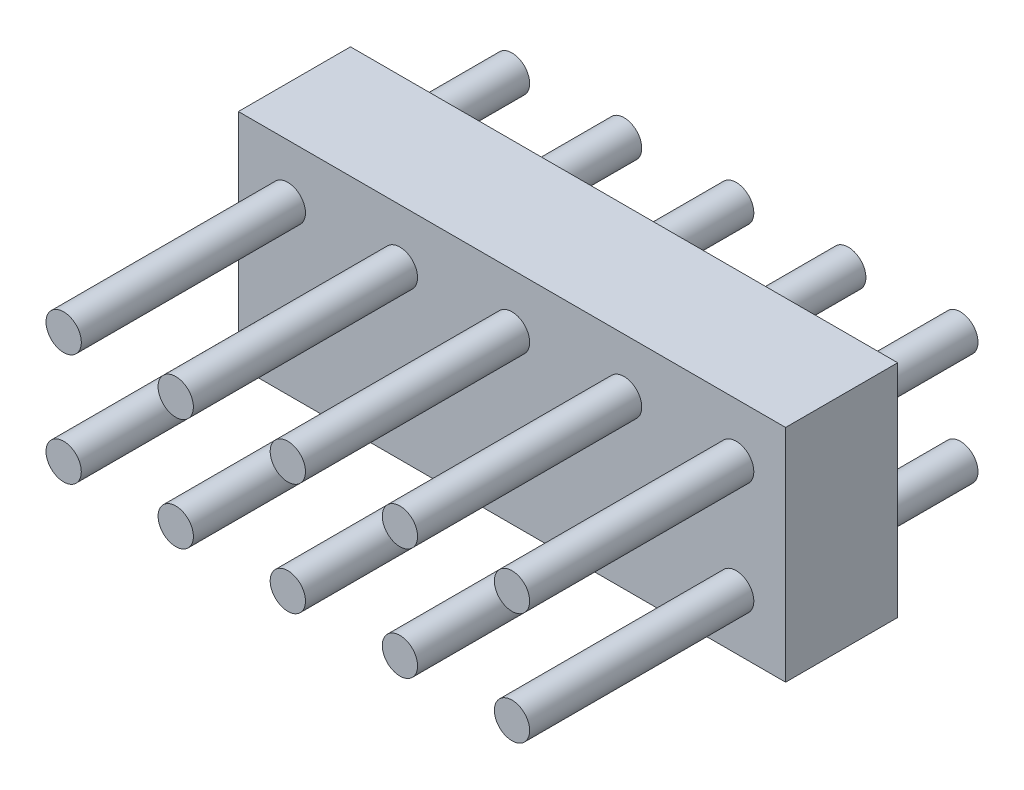
ISO-10303-21;
HEADER;
FILE_DESCRIPTION(('STEP AP214'),'2;1');
FILE_NAME('part.step','',(''),(''),'','','');
FILE_SCHEMA(('AUTOMOTIVE_DESIGN { 1 0 10303 214 1 1 1 1 }'));
ENDSEC;
DATA;
#1=APPLICATION_CONTEXT('core data for automotive mechanical design processes');
#2=APPLICATION_PROTOCOL_DEFINITION('international standard','automotive_design',2000,#1);
#3=PRODUCT_CONTEXT('',#1,'mechanical');
#4=PRODUCT('Part','Part','',(#3));
#5=PRODUCT_RELATED_PRODUCT_CATEGORY('part','',(#4));
#6=PRODUCT_DEFINITION_FORMATION('','',#4);
#7=PRODUCT_DEFINITION_CONTEXT('part definition',#1,'design');
#8=PRODUCT_DEFINITION('design','',#6,#7);
#9=PRODUCT_DEFINITION_SHAPE('','',#8);
#10=(LENGTH_UNIT() NAMED_UNIT(*) SI_UNIT(.MILLI.,.METRE.));
#11=(NAMED_UNIT(*) PLANE_ANGLE_UNIT() SI_UNIT($,.RADIAN.));
#12=(NAMED_UNIT(*) SI_UNIT($,.STERADIAN.) SOLID_ANGLE_UNIT());
#13=UNCERTAINTY_MEASURE_WITH_UNIT(LENGTH_MEASURE(1.E-05),#10,'distance_accuracy_value','');
#14=(GEOMETRIC_REPRESENTATION_CONTEXT(3) GLOBAL_UNCERTAINTY_ASSIGNED_CONTEXT((#13)) GLOBAL_UNIT_ASSIGNED_CONTEXT((#10,
#11,#12)) REPRESENTATION_CONTEXT('',''));
#15=CARTESIAN_POINT('',(0.,0.,0.));
#16=DIRECTION('',(0.,0.,1.));
#17=DIRECTION('',(1.,0.,0.));
#18=AXIS2_PLACEMENT_3D('',#15,#16,#17);
#19=CARTESIAN_POINT('',(0.,-5.,2.54));
#20=DIRECTION('',(0.,0.,1.));
#21=DIRECTION('',(1.,0.,0.));
#22=AXIS2_PLACEMENT_3D('',#19,#20,#21);
#23=PLANE('',#22);
#24=CARTESIAN_POINT('',(3.66,-3.77,2.54));
#25=DIRECTION('',(0.,0.,1.));
#26=DIRECTION('',(1.,0.,0.));
#27=AXIS2_PLACEMENT_3D('',#24,#25,#26);
#28=CIRCLE('',#27,0.4);
#29=CARTESIAN_POINT('',(4.06,-3.77,2.54));
#30=VERTEX_POINT('',#29);
#31=EDGE_CURVE('E277',#30,#30,#28,.F.);
#32=ORIENTED_EDGE('',*,*,#31,.T.);
#33=EDGE_LOOP('',(#32));
#34=FACE_BOUND('',#33,.T.);
#35=CARTESIAN_POINT('',(8.74,-3.77,2.54));
#36=DIRECTION('',(0.,0.,1.));
#37=DIRECTION('',(1.,0.,0.));
#38=AXIS2_PLACEMENT_3D('',#35,#36,#37);
#39=CIRCLE('',#38,0.4);
#40=CARTESIAN_POINT('',(9.14,-3.77,2.54));
#41=VERTEX_POINT('',#40);
#42=EDGE_CURVE('E259',#41,#41,#39,.F.);
#43=ORIENTED_EDGE('',*,*,#42,.T.);
#44=EDGE_LOOP('',(#43));
#45=FACE_BOUND('',#44,.T.);
#46=CARTESIAN_POINT('',(3.66,-1.23,2.54));
#47=DIRECTION('',(0.,0.,1.));
#48=DIRECTION('',(1.,0.,0.));
#49=AXIS2_PLACEMENT_3D('',#46,#47,#48);
#50=CIRCLE('',#49,0.4);
#51=CARTESIAN_POINT('',(4.06,-1.23,2.54));
#52=VERTEX_POINT('',#51);
#53=EDGE_CURVE('E241',#52,#52,#50,.F.);
#54=ORIENTED_EDGE('',*,*,#53,.T.);
#55=EDGE_LOOP('',(#54));
#56=FACE_BOUND('',#55,.T.);
#57=CARTESIAN_POINT('',(8.74,-1.23,2.54));
#58=DIRECTION('',(0.,0.,1.));
#59=DIRECTION('',(1.,0.,0.));
#60=AXIS2_PLACEMENT_3D('',#57,#58,#59);
#61=CIRCLE('',#60,0.4);
#62=CARTESIAN_POINT('',(9.14,-1.23,2.54));
#63=VERTEX_POINT('',#62);
#64=EDGE_CURVE('E223',#63,#63,#61,.F.);
#65=ORIENTED_EDGE('',*,*,#64,.T.);
#66=EDGE_LOOP('',(#65));
#67=FACE_BOUND('',#66,.T.);
#68=CARTESIAN_POINT('',(6.2,-1.23,2.54));
#69=DIRECTION('',(0.,0.,1.));
#70=DIRECTION('',(1.,0.,0.));
#71=AXIS2_PLACEMENT_3D('',#68,#69,#70);
#72=CIRCLE('',#71,0.4);
#73=CARTESIAN_POINT('',(6.6,-1.23,2.54));
#74=VERTEX_POINT('',#73);
#75=EDGE_CURVE('E108',#74,#74,#72,.F.);
#76=ORIENTED_EDGE('',*,*,#75,.T.);
#77=EDGE_LOOP('',(#76));
#78=FACE_BOUND('',#77,.T.);
#79=DIRECTION('',(0.,-1.,0.));
#80=VECTOR('',#79,1.);
#81=CARTESIAN_POINT('',(0.,0.,2.54));
#82=LINE('',#81,#80);
#83=CARTESIAN_POINT('',(0.,0.,2.54));
#84=VERTEX_POINT('',#83);
#85=CARTESIAN_POINT('',(0.,-5.,2.54));
#86=VERTEX_POINT('',#85);
#87=EDGE_CURVE('E90',#84,#86,#82,.T.);
#88=ORIENTED_EDGE('',*,*,#87,.T.);
#89=DIRECTION('',(1.,0.,0.));
#90=VECTOR('',#89,1.);
#91=CARTESIAN_POINT('',(0.,-5.,2.54));
#92=LINE('',#91,#90);
#93=CARTESIAN_POINT('',(12.4,-5.,2.54));
#94=VERTEX_POINT('',#93);
#95=EDGE_CURVE('E85',#86,#94,#92,.T.);
#96=ORIENTED_EDGE('',*,*,#95,.T.);
#97=DIRECTION('',(0.,1.,0.));
#98=VECTOR('',#97,1.);
#99=CARTESIAN_POINT('',(12.4,0.,2.54));
#100=LINE('',#99,#98);
#101=CARTESIAN_POINT('',(12.4,0.,2.54));
#102=VERTEX_POINT('',#101);
#103=EDGE_CURVE('E88',#94,#102,#100,.T.);
#104=ORIENTED_EDGE('',*,*,#103,.T.);
#105=DIRECTION('',(-1.,0.,0.));
#106=VECTOR('',#105,1.);
#107=CARTESIAN_POINT('',(0.,0.,2.54));
#108=LINE('',#107,#106);
#109=EDGE_CURVE('E54',#102,#84,#108,.T.);
#110=ORIENTED_EDGE('',*,*,#109,.T.);
#111=EDGE_LOOP('',(#88,#96,#104,#110));
#112=FACE_BOUND('',#111,.T.);
#113=CARTESIAN_POINT('',(1.12,-1.23,2.54));
#114=DIRECTION('',(0.,0.,1.));
#115=DIRECTION('',(1.,0.,0.));
#116=AXIS2_PLACEMENT_3D('',#113,#114,#115);
#117=CIRCLE('',#116,0.400000000000001);
#118=CARTESIAN_POINT('',(1.52000000000001,-1.23,2.54));
#119=VERTEX_POINT('',#118);
#120=EDGE_CURVE('E214',#119,#119,#117,.F.);
#121=ORIENTED_EDGE('',*,*,#120,.T.);
#122=EDGE_LOOP('',(#121));
#123=FACE_BOUND('',#122,.T.);
#124=CARTESIAN_POINT('',(11.28,-1.23,2.54));
#125=DIRECTION('',(0.,0.,1.));
#126=DIRECTION('',(1.,0.,0.));
#127=AXIS2_PLACEMENT_3D('',#124,#125,#126);
#128=CIRCLE('',#127,0.400000000000001);
#129=CARTESIAN_POINT('',(11.68,-1.23,2.54));
#130=VERTEX_POINT('',#129);
#131=EDGE_CURVE('E232',#130,#130,#128,.F.);
#132=ORIENTED_EDGE('',*,*,#131,.T.);
#133=EDGE_LOOP('',(#132));
#134=FACE_BOUND('',#133,.T.);
#135=CARTESIAN_POINT('',(11.28,-3.77,2.54));
#136=DIRECTION('',(0.,0.,1.));
#137=DIRECTION('',(1.,0.,0.));
#138=AXIS2_PLACEMENT_3D('',#135,#136,#137);
#139=CIRCLE('',#138,0.400000000000001);
#140=CARTESIAN_POINT('',(11.68,-3.77,2.54));
#141=VERTEX_POINT('',#140);
#142=EDGE_CURVE('E250',#141,#141,#139,.F.);
#143=ORIENTED_EDGE('',*,*,#142,.T.);
#144=EDGE_LOOP('',(#143));
#145=FACE_BOUND('',#144,.T.);
#146=CARTESIAN_POINT('',(6.2,-3.77,2.54));
#147=DIRECTION('',(0.,0.,1.));
#148=DIRECTION('',(1.,0.,0.));
#149=AXIS2_PLACEMENT_3D('',#146,#147,#148);
#150=CIRCLE('',#149,0.4);
#151=CARTESIAN_POINT('',(6.6,-3.77,2.54));
#152=VERTEX_POINT('',#151);
#153=EDGE_CURVE('E268',#152,#152,#150,.F.);
#154=ORIENTED_EDGE('',*,*,#153,.T.);
#155=EDGE_LOOP('',(#154));
#156=FACE_BOUND('',#155,.T.);
#157=CARTESIAN_POINT('',(1.12,-3.77,2.54));
#158=DIRECTION('',(0.,0.,1.));
#159=DIRECTION('',(1.,0.,0.));
#160=AXIS2_PLACEMENT_3D('',#157,#158,#159);
#161=CIRCLE('',#160,0.400000000000002);
#162=CARTESIAN_POINT('',(1.52000000000001,-3.77,2.54));
#163=VERTEX_POINT('',#162);
#164=EDGE_CURVE('E285',#163,#163,#161,.F.);
#165=ORIENTED_EDGE('',*,*,#164,.T.);
#166=EDGE_LOOP('',(#165));
#167=FACE_BOUND('',#166,.T.);
#168=ADVANCED_FACE('F37',(#34,#45,#56,#67,#78,#112,#123,#134,#145,#156,#167),#23,.T.);
#169=CARTESIAN_POINT('',(0.,-5.,0.));
#170=DIRECTION('',(0.,0.,1.));
#171=DIRECTION('',(1.,0.,0.));
#172=AXIS2_PLACEMENT_3D('',#169,#170,#171);
#173=PLANE('',#172);
#174=CARTESIAN_POINT('',(3.66,-3.77,0.));
#175=DIRECTION('',(0.,0.,1.));
#176=DIRECTION('',(1.,0.,0.));
#177=AXIS2_PLACEMENT_3D('',#174,#175,#176);
#178=CIRCLE('',#177,0.4);
#179=CARTESIAN_POINT('',(4.06,-3.77,0.));
#180=VERTEX_POINT('',#179);
#181=EDGE_CURVE('E46',#180,#180,#178,.F.);
#182=ORIENTED_EDGE('',*,*,#181,.F.);
#183=EDGE_LOOP('',(#182));
#184=FACE_BOUND('',#183,.T.);
#185=CARTESIAN_POINT('',(8.74,-3.77,0.));
#186=DIRECTION('',(0.,0.,1.));
#187=DIRECTION('',(1.,0.,0.));
#188=AXIS2_PLACEMENT_3D('',#185,#186,#187);
#189=CIRCLE('',#188,0.4);
#190=CARTESIAN_POINT('',(9.14,-3.77,0.));
#191=VERTEX_POINT('',#190);
#192=EDGE_CURVE('E133',#191,#191,#189,.F.);
#193=ORIENTED_EDGE('',*,*,#192,.F.);
#194=EDGE_LOOP('',(#193));
#195=FACE_BOUND('',#194,.T.);
#196=CARTESIAN_POINT('',(3.66,-1.23,0.));
#197=DIRECTION('',(0.,0.,1.));
#198=DIRECTION('',(1.,0.,0.));
#199=AXIS2_PLACEMENT_3D('',#196,#197,#198);
#200=CIRCLE('',#199,0.4);
#201=CARTESIAN_POINT('',(4.06,-1.23,0.));
#202=VERTEX_POINT('',#201);
#203=EDGE_CURVE('E127',#202,#202,#200,.F.);
#204=ORIENTED_EDGE('',*,*,#203,.F.);
#205=EDGE_LOOP('',(#204));
#206=FACE_BOUND('',#205,.T.);
#207=CARTESIAN_POINT('',(8.74,-1.23,0.));
#208=DIRECTION('',(0.,0.,1.));
#209=DIRECTION('',(1.,0.,0.));
#210=AXIS2_PLACEMENT_3D('',#207,#208,#209);
#211=CIRCLE('',#210,0.4);
#212=CARTESIAN_POINT('',(9.14,-1.23,0.));
#213=VERTEX_POINT('',#212);
#214=EDGE_CURVE('E121',#213,#213,#211,.F.);
#215=ORIENTED_EDGE('',*,*,#214,.F.);
#216=EDGE_LOOP('',(#215));
#217=FACE_BOUND('',#216,.T.);
#218=CARTESIAN_POINT('',(6.2,-1.23,0.));
#219=DIRECTION('',(0.,0.,1.));
#220=DIRECTION('',(1.,0.,0.));
#221=AXIS2_PLACEMENT_3D('',#218,#219,#220);
#222=CIRCLE('',#221,0.4);
#223=CARTESIAN_POINT('',(6.6,-1.23,0.));
#224=VERTEX_POINT('',#223);
#225=EDGE_CURVE('E115',#224,#224,#222,.F.);
#226=ORIENTED_EDGE('',*,*,#225,.F.);
#227=EDGE_LOOP('',(#226));
#228=FACE_BOUND('',#227,.T.);
#229=DIRECTION('',(0.,-1.,0.));
#230=VECTOR('',#229,1.);
#231=CARTESIAN_POINT('',(0.,0.,0.));
#232=LINE('',#231,#230);
#233=CARTESIAN_POINT('',(0.,0.,0.));
#234=VERTEX_POINT('',#233);
#235=CARTESIAN_POINT('',(0.,-5.,0.));
#236=VERTEX_POINT('',#235);
#237=EDGE_CURVE('E105',#234,#236,#232,.T.);
#238=ORIENTED_EDGE('',*,*,#237,.F.);
#239=DIRECTION('',(-1.,0.,0.));
#240=VECTOR('',#239,1.);
#241=CARTESIAN_POINT('',(0.,0.,0.));
#242=LINE('',#241,#240);
#243=CARTESIAN_POINT('',(12.4,0.,0.));
#244=VERTEX_POINT('',#243);
#245=EDGE_CURVE('E77',#244,#234,#242,.T.);
#246=ORIENTED_EDGE('',*,*,#245,.F.);
#247=DIRECTION('',(0.,1.,0.));
#248=VECTOR('',#247,1.);
#249=CARTESIAN_POINT('',(12.4,0.,0.));
#250=LINE('',#249,#248);
#251=CARTESIAN_POINT('',(12.4,-5.,0.));
#252=VERTEX_POINT('',#251);
#253=EDGE_CURVE('E71',#252,#244,#250,.T.);
#254=ORIENTED_EDGE('',*,*,#253,.F.);
#255=DIRECTION('',(1.,0.,0.));
#256=VECTOR('',#255,1.);
#257=CARTESIAN_POINT('',(0.,-5.,0.));
#258=LINE('',#257,#256);
#259=EDGE_CURVE('E95',#236,#252,#258,.T.);
#260=ORIENTED_EDGE('',*,*,#259,.F.);
#261=EDGE_LOOP('',(#238,#246,#254,#260));
#262=FACE_BOUND('',#261,.T.);
#263=CARTESIAN_POINT('',(1.12,-1.23,0.));
#264=DIRECTION('',(0.,0.,1.));
#265=DIRECTION('',(1.,0.,0.));
#266=AXIS2_PLACEMENT_3D('',#263,#264,#265);
#267=CIRCLE('',#266,0.400000000000001);
#268=CARTESIAN_POINT('',(1.52000000000001,-1.23,0.));
#269=VERTEX_POINT('',#268);
#270=EDGE_CURVE('E118',#269,#269,#267,.F.);
#271=ORIENTED_EDGE('',*,*,#270,.F.);
#272=EDGE_LOOP('',(#271));
#273=FACE_BOUND('',#272,.T.);
#274=CARTESIAN_POINT('',(11.28,-1.23,0.));
#275=DIRECTION('',(0.,0.,1.));
#276=DIRECTION('',(1.,0.,0.));
#277=AXIS2_PLACEMENT_3D('',#274,#275,#276);
#278=CIRCLE('',#277,0.400000000000001);
#279=CARTESIAN_POINT('',(11.68,-1.23,0.));
#280=VERTEX_POINT('',#279);
#281=EDGE_CURVE('E124',#280,#280,#278,.F.);
#282=ORIENTED_EDGE('',*,*,#281,.F.);
#283=EDGE_LOOP('',(#282));
#284=FACE_BOUND('',#283,.T.);
#285=CARTESIAN_POINT('',(11.28,-3.77,0.));
#286=DIRECTION('',(0.,0.,1.));
#287=DIRECTION('',(1.,0.,0.));
#288=AXIS2_PLACEMENT_3D('',#285,#286,#287);
#289=CIRCLE('',#288,0.400000000000001);
#290=CARTESIAN_POINT('',(11.68,-3.77,0.));
#291=VERTEX_POINT('',#290);
#292=EDGE_CURVE('E130',#291,#291,#289,.F.);
#293=ORIENTED_EDGE('',*,*,#292,.F.);
#294=EDGE_LOOP('',(#293));
#295=FACE_BOUND('',#294,.T.);
#296=CARTESIAN_POINT('',(6.2,-3.77,0.));
#297=DIRECTION('',(0.,0.,1.));
#298=DIRECTION('',(1.,0.,0.));
#299=AXIS2_PLACEMENT_3D('',#296,#297,#298);
#300=CIRCLE('',#299,0.4);
#301=CARTESIAN_POINT('',(6.6,-3.77,0.));
#302=VERTEX_POINT('',#301);
#303=EDGE_CURVE('E136',#302,#302,#300,.F.);
#304=ORIENTED_EDGE('',*,*,#303,.F.);
#305=EDGE_LOOP('',(#304));
#306=FACE_BOUND('',#305,.T.);
#307=CARTESIAN_POINT('',(1.12,-3.77,0.));
#308=DIRECTION('',(0.,0.,1.));
#309=DIRECTION('',(1.,0.,0.));
#310=AXIS2_PLACEMENT_3D('',#307,#308,#309);
#311=CIRCLE('',#310,0.400000000000002);
#312=CARTESIAN_POINT('',(1.52000000000001,-3.77,0.));
#313=VERTEX_POINT('',#312);
#314=EDGE_CURVE('E11',#313,#313,#311,.F.);
#315=ORIENTED_EDGE('',*,*,#314,.F.);
#316=EDGE_LOOP('',(#315));
#317=FACE_BOUND('',#316,.T.);
#318=ADVANCED_FACE('F143',(#184,#195,#206,#217,#228,#262,#273,#284,#295,#306,#317),#173,.F.);
#319=CARTESIAN_POINT('',(0.,0.,2.54));
#320=DIRECTION('',(1.,0.,0.));
#321=DIRECTION('',(0.,1.,0.));
#322=AXIS2_PLACEMENT_3D('',#319,#320,#321);
#323=PLANE('',#322);
#324=ORIENTED_EDGE('',*,*,#237,.T.);
#325=DIRECTION('',(0.,0.,-1.));
#326=VECTOR('',#325,1.);
#327=CARTESIAN_POINT('',(0.,-5.,2.54));
#328=LINE('',#327,#326);
#329=EDGE_CURVE('E96',#86,#236,#328,.T.);
#330=ORIENTED_EDGE('',*,*,#329,.F.);
#331=ORIENTED_EDGE('',*,*,#87,.F.);
#332=DIRECTION('',(0.,0.,-1.));
#333=VECTOR('',#332,1.);
#334=CARTESIAN_POINT('',(0.,0.,2.54));
#335=LINE('',#334,#333);
#336=EDGE_CURVE('E101',#84,#234,#335,.T.);
#337=ORIENTED_EDGE('',*,*,#336,.T.);
#338=EDGE_LOOP('',(#324,#330,#331,#337));
#339=FACE_BOUND('',#338,.T.);
#340=ADVANCED_FACE('F39',(#339),#323,.F.);
#341=CARTESIAN_POINT('',(0.,-5.,2.54));
#342=DIRECTION('',(0.,1.,0.));
#343=DIRECTION('',(0.,0.,1.));
#344=AXIS2_PLACEMENT_3D('',#341,#342,#343);
#345=PLANE('',#344);
#346=ORIENTED_EDGE('',*,*,#259,.T.);
#347=DIRECTION('',(0.,0.,-1.));
#348=VECTOR('',#347,1.);
#349=CARTESIAN_POINT('',(12.4,-5.,2.54));
#350=LINE('',#349,#348);
#351=EDGE_CURVE('E93',#94,#252,#350,.T.);
#352=ORIENTED_EDGE('',*,*,#351,.F.);
#353=ORIENTED_EDGE('',*,*,#95,.F.);
#354=ORIENTED_EDGE('',*,*,#329,.T.);
#355=EDGE_LOOP('',(#346,#352,#353,#354));
#356=FACE_BOUND('',#355,.T.);
#357=ADVANCED_FACE('F94',(#356),#345,.F.);
#358=CARTESIAN_POINT('',(12.4,0.,2.54));
#359=DIRECTION('',(-1.,0.,0.));
#360=DIRECTION('',(0.,-1.,0.));
#361=AXIS2_PLACEMENT_3D('',#358,#359,#360);
#362=PLANE('',#361);
#363=ORIENTED_EDGE('',*,*,#253,.T.);
#364=DIRECTION('',(0.,0.,-1.));
#365=VECTOR('',#364,1.);
#366=CARTESIAN_POINT('',(12.4,0.,2.54));
#367=LINE('',#366,#365);
#368=EDGE_CURVE('E97',#102,#244,#367,.T.);
#369=ORIENTED_EDGE('',*,*,#368,.F.);
#370=ORIENTED_EDGE('',*,*,#103,.F.);
#371=ORIENTED_EDGE('',*,*,#351,.T.);
#372=EDGE_LOOP('',(#363,#369,#370,#371));
#373=FACE_BOUND('',#372,.T.);
#374=ADVANCED_FACE('F99',(#373),#362,.F.);
#375=CARTESIAN_POINT('',(0.,0.,2.54));
#376=DIRECTION('',(0.,-1.,0.));
#377=DIRECTION('',(0.,0.,-1.));
#378=AXIS2_PLACEMENT_3D('',#375,#376,#377);
#379=PLANE('',#378);
#380=ORIENTED_EDGE('',*,*,#245,.T.);
#381=ORIENTED_EDGE('',*,*,#336,.F.);
#382=ORIENTED_EDGE('',*,*,#109,.F.);
#383=ORIENTED_EDGE('',*,*,#368,.T.);
#384=EDGE_LOOP('',(#380,#381,#382,#383));
#385=FACE_BOUND('',#384,.T.);
#386=ADVANCED_FACE('F195',(#385),#379,.F.);
#387=CARTESIAN_POINT('',(6.2,-1.23,-2.54));
#388=DIRECTION('',(0.,0.,1.));
#389=DIRECTION('',(1.,0.,0.));
#390=AXIS2_PLACEMENT_3D('',#387,#388,#389);
#391=PLANE('',#390);
#392=CARTESIAN_POINT('',(6.2,-1.23,-2.54));
#393=DIRECTION('',(0.,0.,1.));
#394=DIRECTION('',(1.,0.,0.));
#395=AXIS2_PLACEMENT_3D('',#392,#393,#394);
#396=CIRCLE('',#395,0.4);
#397=CARTESIAN_POINT('',(6.6,-1.23,-2.54));
#398=VERTEX_POINT('',#397);
#399=EDGE_CURVE('E211',#398,#398,#396,.T.);
#400=ORIENTED_EDGE('',*,*,#399,.F.);
#401=EDGE_LOOP('',(#400));
#402=FACE_BOUND('',#401,.T.);
#403=ADVANCED_FACE('F198',(#402),#391,.F.);
#404=CARTESIAN_POINT('',(6.2,-1.23,7.62));
#405=DIRECTION('',(0.,0.,-1.));
#406=DIRECTION('',(-1.,0.,0.));
#407=AXIS2_PLACEMENT_3D('',#404,#405,#406);
#408=CYLINDRICAL_SURFACE('',#407,0.4);
#409=ORIENTED_EDGE('',*,*,#399,.T.);
#410=EDGE_LOOP('',(#409));
#411=FACE_BOUND('',#410,.T.);
#412=ORIENTED_EDGE('',*,*,#225,.T.);
#413=EDGE_LOOP('',(#412));
#414=FACE_BOUND('',#413,.T.);
#415=ADVANCED_FACE('F643',(#411,#414),#408,.T.);
#416=ORIENTED_EDGE('',*,*,#75,.F.);
#417=EDGE_LOOP('',(#416));
#418=FACE_BOUND('',#417,.T.);
#419=CARTESIAN_POINT('',(6.2,-1.23,7.62));
#420=DIRECTION('',(0.,0.,1.));
#421=DIRECTION('',(1.,0.,0.));
#422=AXIS2_PLACEMENT_3D('',#419,#420,#421);
#423=CIRCLE('',#422,0.4);
#424=CARTESIAN_POINT('',(6.6,-1.23,7.62));
#425=VERTEX_POINT('',#424);
#426=EDGE_CURVE('E210',#425,#425,#423,.T.);
#427=ORIENTED_EDGE('',*,*,#426,.F.);
#428=EDGE_LOOP('',(#427));
#429=FACE_BOUND('',#428,.T.);
#430=ADVANCED_FACE('F192',(#418,#429),#408,.T.);
#431=CARTESIAN_POINT('',(6.2,-1.23,7.62));
#432=DIRECTION('',(0.,0.,1.));
#433=DIRECTION('',(1.,0.,0.));
#434=AXIS2_PLACEMENT_3D('',#431,#432,#433);
#435=PLANE('',#434);
#436=ORIENTED_EDGE('',*,*,#426,.T.);
#437=EDGE_LOOP('',(#436));
#438=FACE_BOUND('',#437,.T.);
#439=ADVANCED_FACE('F624',(#438),#435,.T.);
#440=CARTESIAN_POINT('',(1.12,-1.23,-2.54));
#441=DIRECTION('',(0.,0.,-1.));
#442=DIRECTION('',(-1.,0.,0.));
#443=AXIS2_PLACEMENT_3D('',#440,#441,#442);
#444=PLANE('',#443);
#445=CARTESIAN_POINT('',(1.12,-1.23,-2.54));
#446=DIRECTION('',(0.,0.,1.));
#447=DIRECTION('',(-1.,0.,0.));
#448=AXIS2_PLACEMENT_3D('',#445,#446,#447);
#449=CIRCLE('',#448,0.400000000000001);
#450=CARTESIAN_POINT('',(0.720000000000003,-1.23,-2.54));
#451=VERTEX_POINT('',#450);
#452=EDGE_CURVE('E220',#451,#451,#449,.T.);
#453=ORIENTED_EDGE('',*,*,#452,.F.);
#454=EDGE_LOOP('',(#453));
#455=FACE_BOUND('',#454,.T.);
#456=ADVANCED_FACE('F615',(#455),#444,.T.);
#457=CARTESIAN_POINT('',(1.12,-1.23,7.62));
#458=DIRECTION('',(0.,0.,-1.));
#459=DIRECTION('',(-1.,0.,0.));
#460=AXIS2_PLACEMENT_3D('',#457,#458,#459);
#461=CYLINDRICAL_SURFACE('',#460,0.400000000000001);
#462=ORIENTED_EDGE('',*,*,#452,.T.);
#463=EDGE_LOOP('',(#462));
#464=FACE_BOUND('',#463,.T.);
#465=ORIENTED_EDGE('',*,*,#270,.T.);
#466=EDGE_LOOP('',(#465));
#467=FACE_BOUND('',#466,.T.);
#468=ADVANCED_FACE('F605',(#464,#467),#461,.T.);
#469=ORIENTED_EDGE('',*,*,#120,.F.);
#470=EDGE_LOOP('',(#469));
#471=FACE_BOUND('',#470,.T.);
#472=CARTESIAN_POINT('',(1.12,-1.23,7.62));
#473=DIRECTION('',(0.,0.,1.));
#474=DIRECTION('',(-1.,0.,0.));
#475=AXIS2_PLACEMENT_3D('',#472,#473,#474);
#476=CIRCLE('',#475,0.400000000000001);
#477=CARTESIAN_POINT('',(0.720000000000003,-1.23,7.62));
#478=VERTEX_POINT('',#477);
#479=EDGE_CURVE('E219',#478,#478,#476,.T.);
#480=ORIENTED_EDGE('',*,*,#479,.F.);
#481=EDGE_LOOP('',(#480));
#482=FACE_BOUND('',#481,.T.);
#483=ADVANCED_FACE('F595',(#471,#482),#461,.T.);
#484=CARTESIAN_POINT('',(1.12,-1.23,7.62));
#485=DIRECTION('',(0.,0.,-1.));
#486=DIRECTION('',(-1.,0.,0.));
#487=AXIS2_PLACEMENT_3D('',#484,#485,#486);
#488=PLANE('',#487);
#489=ORIENTED_EDGE('',*,*,#479,.T.);
#490=EDGE_LOOP('',(#489));
#491=FACE_BOUND('',#490,.T.);
#492=ADVANCED_FACE('F585',(#491),#488,.F.);
#493=CARTESIAN_POINT('',(8.74,-1.23,-2.54));
#494=DIRECTION('',(0.,0.,1.));
#495=DIRECTION('',(1.,0.,0.));
#496=AXIS2_PLACEMENT_3D('',#493,#494,#495);
#497=PLANE('',#496);
#498=CARTESIAN_POINT('',(8.74,-1.23,-2.54));
#499=DIRECTION('',(0.,0.,1.));
#500=DIRECTION('',(1.,0.,0.));
#501=AXIS2_PLACEMENT_3D('',#498,#499,#500);
#502=CIRCLE('',#501,0.4);
#503=CARTESIAN_POINT('',(9.14,-1.23,-2.54));
#504=VERTEX_POINT('',#503);
#505=EDGE_CURVE('E229',#504,#504,#502,.T.);
#506=ORIENTED_EDGE('',*,*,#505,.F.);
#507=EDGE_LOOP('',(#506));
#508=FACE_BOUND('',#507,.T.);
#509=ADVANCED_FACE('F576',(#508),#497,.F.);
#510=CARTESIAN_POINT('',(8.74,-1.23,7.62));
#511=DIRECTION('',(0.,0.,-1.));
#512=DIRECTION('',(-1.,0.,0.));
#513=AXIS2_PLACEMENT_3D('',#510,#511,#512);
#514=CYLINDRICAL_SURFACE('',#513,0.4);
#515=ORIENTED_EDGE('',*,*,#505,.T.);
#516=EDGE_LOOP('',(#515));
#517=FACE_BOUND('',#516,.T.);
#518=ORIENTED_EDGE('',*,*,#214,.T.);
#519=EDGE_LOOP('',(#518));
#520=FACE_BOUND('',#519,.T.);
#521=ADVANCED_FACE('F566',(#517,#520),#514,.T.);
#522=ORIENTED_EDGE('',*,*,#64,.F.);
#523=EDGE_LOOP('',(#522));
#524=FACE_BOUND('',#523,.T.);
#525=CARTESIAN_POINT('',(8.74,-1.23,7.62));
#526=DIRECTION('',(0.,0.,1.));
#527=DIRECTION('',(1.,0.,0.));
#528=AXIS2_PLACEMENT_3D('',#525,#526,#527);
#529=CIRCLE('',#528,0.4);
#530=CARTESIAN_POINT('',(9.14,-1.23,7.62));
#531=VERTEX_POINT('',#530);
#532=EDGE_CURVE('E228',#531,#531,#529,.T.);
#533=ORIENTED_EDGE('',*,*,#532,.F.);
#534=EDGE_LOOP('',(#533));
#535=FACE_BOUND('',#534,.T.);
#536=ADVANCED_FACE('F556',(#524,#535),#514,.T.);
#537=CARTESIAN_POINT('',(8.74,-1.23,7.62));
#538=DIRECTION('',(0.,0.,1.));
#539=DIRECTION('',(1.,0.,0.));
#540=AXIS2_PLACEMENT_3D('',#537,#538,#539);
#541=PLANE('',#540);
#542=ORIENTED_EDGE('',*,*,#532,.T.);
#543=EDGE_LOOP('',(#542));
#544=FACE_BOUND('',#543,.T.);
#545=ADVANCED_FACE('F546',(#544),#541,.T.);
#546=CARTESIAN_POINT('',(11.28,-1.23,-2.54));
#547=DIRECTION('',(0.,0.,1.));
#548=DIRECTION('',(1.,0.,0.));
#549=AXIS2_PLACEMENT_3D('',#546,#547,#548);
#550=PLANE('',#549);
#551=CARTESIAN_POINT('',(11.28,-1.23,-2.54));
#552=DIRECTION('',(0.,0.,1.));
#553=DIRECTION('',(1.,0.,0.));
#554=AXIS2_PLACEMENT_3D('',#551,#552,#553);
#555=CIRCLE('',#554,0.400000000000001);
#556=CARTESIAN_POINT('',(11.68,-1.23,-2.54));
#557=VERTEX_POINT('',#556);
#558=EDGE_CURVE('E238',#557,#557,#555,.T.);
#559=ORIENTED_EDGE('',*,*,#558,.F.);
#560=EDGE_LOOP('',(#559));
#561=FACE_BOUND('',#560,.T.);
#562=ADVANCED_FACE('F537',(#561),#550,.F.);
#563=CARTESIAN_POINT('',(11.28,-1.23,7.62));
#564=DIRECTION('',(0.,0.,-1.));
#565=DIRECTION('',(-1.,0.,0.));
#566=AXIS2_PLACEMENT_3D('',#563,#564,#565);
#567=CYLINDRICAL_SURFACE('',#566,0.400000000000001);
#568=ORIENTED_EDGE('',*,*,#558,.T.);
#569=EDGE_LOOP('',(#568));
#570=FACE_BOUND('',#569,.T.);
#571=ORIENTED_EDGE('',*,*,#281,.T.);
#572=EDGE_LOOP('',(#571));
#573=FACE_BOUND('',#572,.T.);
#574=ADVANCED_FACE('F527',(#570,#573),#567,.T.);
#575=ORIENTED_EDGE('',*,*,#131,.F.);
#576=EDGE_LOOP('',(#575));
#577=FACE_BOUND('',#576,.T.);
#578=CARTESIAN_POINT('',(11.28,-1.23,7.62));
#579=DIRECTION('',(0.,0.,1.));
#580=DIRECTION('',(1.,0.,0.));
#581=AXIS2_PLACEMENT_3D('',#578,#579,#580);
#582=CIRCLE('',#581,0.400000000000001);
#583=CARTESIAN_POINT('',(11.68,-1.23,7.62));
#584=VERTEX_POINT('',#583);
#585=EDGE_CURVE('E237',#584,#584,#582,.T.);
#586=ORIENTED_EDGE('',*,*,#585,.F.);
#587=EDGE_LOOP('',(#586));
#588=FACE_BOUND('',#587,.T.);
#589=ADVANCED_FACE('F517',(#577,#588),#567,.T.);
#590=CARTESIAN_POINT('',(11.28,-1.23,7.62));
#591=DIRECTION('',(0.,0.,1.));
#592=DIRECTION('',(1.,0.,0.));
#593=AXIS2_PLACEMENT_3D('',#590,#591,#592);
#594=PLANE('',#593);
#595=ORIENTED_EDGE('',*,*,#585,.T.);
#596=EDGE_LOOP('',(#595));
#597=FACE_BOUND('',#596,.T.);
#598=ADVANCED_FACE('F507',(#597),#594,.T.);
#599=CARTESIAN_POINT('',(3.66,-1.23,-2.54));
#600=DIRECTION('',(0.,0.,-1.));
#601=DIRECTION('',(-1.,0.,0.));
#602=AXIS2_PLACEMENT_3D('',#599,#600,#601);
#603=PLANE('',#602);
#604=CARTESIAN_POINT('',(3.66,-1.23,-2.54));
#605=DIRECTION('',(0.,0.,1.));
#606=DIRECTION('',(-1.,0.,0.));
#607=AXIS2_PLACEMENT_3D('',#604,#605,#606);
#608=CIRCLE('',#607,0.4);
#609=CARTESIAN_POINT('',(3.26,-1.23,-2.54));
#610=VERTEX_POINT('',#609);
#611=EDGE_CURVE('E247',#610,#610,#608,.T.);
#612=ORIENTED_EDGE('',*,*,#611,.F.);
#613=EDGE_LOOP('',(#612));
#614=FACE_BOUND('',#613,.T.);
#615=ADVANCED_FACE('F498',(#614),#603,.T.);
#616=CARTESIAN_POINT('',(3.66,-1.23,7.62));
#617=DIRECTION('',(0.,0.,-1.));
#618=DIRECTION('',(-1.,0.,0.));
#619=AXIS2_PLACEMENT_3D('',#616,#617,#618);
#620=CYLINDRICAL_SURFACE('',#619,0.4);
#621=ORIENTED_EDGE('',*,*,#611,.T.);
#622=EDGE_LOOP('',(#621));
#623=FACE_BOUND('',#622,.T.);
#624=ORIENTED_EDGE('',*,*,#203,.T.);
#625=EDGE_LOOP('',(#624));
#626=FACE_BOUND('',#625,.T.);
#627=ADVANCED_FACE('F488',(#623,#626),#620,.T.);
#628=ORIENTED_EDGE('',*,*,#53,.F.);
#629=EDGE_LOOP('',(#628));
#630=FACE_BOUND('',#629,.T.);
#631=CARTESIAN_POINT('',(3.66,-1.23,7.62));
#632=DIRECTION('',(0.,0.,1.));
#633=DIRECTION('',(-1.,0.,0.));
#634=AXIS2_PLACEMENT_3D('',#631,#632,#633);
#635=CIRCLE('',#634,0.4);
#636=CARTESIAN_POINT('',(3.26,-1.23,7.62));
#637=VERTEX_POINT('',#636);
#638=EDGE_CURVE('E246',#637,#637,#635,.T.);
#639=ORIENTED_EDGE('',*,*,#638,.F.);
#640=EDGE_LOOP('',(#639));
#641=FACE_BOUND('',#640,.T.);
#642=ADVANCED_FACE('F478',(#630,#641),#620,.T.);
#643=CARTESIAN_POINT('',(3.66,-1.23,7.62));
#644=DIRECTION('',(0.,0.,-1.));
#645=DIRECTION('',(-1.,0.,0.));
#646=AXIS2_PLACEMENT_3D('',#643,#644,#645);
#647=PLANE('',#646);
#648=ORIENTED_EDGE('',*,*,#638,.T.);
#649=EDGE_LOOP('',(#648));
#650=FACE_BOUND('',#649,.T.);
#651=ADVANCED_FACE('F468',(#650),#647,.F.);
#652=CARTESIAN_POINT('',(11.28,-3.77,-2.54));
#653=DIRECTION('',(0.,0.,-1.));
#654=DIRECTION('',(-1.,0.,0.));
#655=AXIS2_PLACEMENT_3D('',#652,#653,#654);
#656=PLANE('',#655);
#657=CARTESIAN_POINT('',(11.28,-3.77,-2.54));
#658=DIRECTION('',(0.,0.,1.));
#659=DIRECTION('',(-1.,0.,0.));
#660=AXIS2_PLACEMENT_3D('',#657,#658,#659);
#661=CIRCLE('',#660,0.400000000000001);
#662=CARTESIAN_POINT('',(10.88,-3.77,-2.54));
#663=VERTEX_POINT('',#662);
#664=EDGE_CURVE('E256',#663,#663,#661,.T.);
#665=ORIENTED_EDGE('',*,*,#664,.F.);
#666=EDGE_LOOP('',(#665));
#667=FACE_BOUND('',#666,.T.);
#668=ADVANCED_FACE('F459',(#667),#656,.T.);
#669=CARTESIAN_POINT('',(11.28,-3.77,7.62));
#670=DIRECTION('',(0.,0.,-1.));
#671=DIRECTION('',(-1.,0.,0.));
#672=AXIS2_PLACEMENT_3D('',#669,#670,#671);
#673=CYLINDRICAL_SURFACE('',#672,0.400000000000001);
#674=ORIENTED_EDGE('',*,*,#664,.T.);
#675=EDGE_LOOP('',(#674));
#676=FACE_BOUND('',#675,.T.);
#677=ORIENTED_EDGE('',*,*,#292,.T.);
#678=EDGE_LOOP('',(#677));
#679=FACE_BOUND('',#678,.T.);
#680=ADVANCED_FACE('F449',(#676,#679),#673,.T.);
#681=ORIENTED_EDGE('',*,*,#142,.F.);
#682=EDGE_LOOP('',(#681));
#683=FACE_BOUND('',#682,.T.);
#684=CARTESIAN_POINT('',(11.28,-3.77,7.62));
#685=DIRECTION('',(0.,0.,1.));
#686=DIRECTION('',(-1.,0.,0.));
#687=AXIS2_PLACEMENT_3D('',#684,#685,#686);
#688=CIRCLE('',#687,0.400000000000001);
#689=CARTESIAN_POINT('',(10.88,-3.77,7.62));
#690=VERTEX_POINT('',#689);
#691=EDGE_CURVE('E255',#690,#690,#688,.T.);
#692=ORIENTED_EDGE('',*,*,#691,.F.);
#693=EDGE_LOOP('',(#692));
#694=FACE_BOUND('',#693,.T.);
#695=ADVANCED_FACE('F439',(#683,#694),#673,.T.);
#696=CARTESIAN_POINT('',(11.28,-3.77,7.62));
#697=DIRECTION('',(0.,0.,-1.));
#698=DIRECTION('',(-1.,0.,0.));
#699=AXIS2_PLACEMENT_3D('',#696,#697,#698);
#700=PLANE('',#699);
#701=ORIENTED_EDGE('',*,*,#691,.T.);
#702=EDGE_LOOP('',(#701));
#703=FACE_BOUND('',#702,.T.);
#704=ADVANCED_FACE('F429',(#703),#700,.F.);
#705=CARTESIAN_POINT('',(8.74,-3.77,-2.54));
#706=DIRECTION('',(0.,0.,-1.));
#707=DIRECTION('',(-1.,0.,0.));
#708=AXIS2_PLACEMENT_3D('',#705,#706,#707);
#709=PLANE('',#708);
#710=CARTESIAN_POINT('',(8.74,-3.77,-2.54));
#711=DIRECTION('',(0.,0.,1.));
#712=DIRECTION('',(-1.,0.,0.));
#713=AXIS2_PLACEMENT_3D('',#710,#711,#712);
#714=CIRCLE('',#713,0.4);
#715=CARTESIAN_POINT('',(8.34,-3.77,-2.54));
#716=VERTEX_POINT('',#715);
#717=EDGE_CURVE('E265',#716,#716,#714,.T.);
#718=ORIENTED_EDGE('',*,*,#717,.F.);
#719=EDGE_LOOP('',(#718));
#720=FACE_BOUND('',#719,.T.);
#721=ADVANCED_FACE('F420',(#720),#709,.T.);
#722=CARTESIAN_POINT('',(8.74,-3.77,7.62));
#723=DIRECTION('',(0.,0.,-1.));
#724=DIRECTION('',(-1.,0.,0.));
#725=AXIS2_PLACEMENT_3D('',#722,#723,#724);
#726=CYLINDRICAL_SURFACE('',#725,0.4);
#727=ORIENTED_EDGE('',*,*,#717,.T.);
#728=EDGE_LOOP('',(#727));
#729=FACE_BOUND('',#728,.T.);
#730=ORIENTED_EDGE('',*,*,#192,.T.);
#731=EDGE_LOOP('',(#730));
#732=FACE_BOUND('',#731,.T.);
#733=ADVANCED_FACE('F410',(#729,#732),#726,.T.);
#734=ORIENTED_EDGE('',*,*,#42,.F.);
#735=EDGE_LOOP('',(#734));
#736=FACE_BOUND('',#735,.T.);
#737=CARTESIAN_POINT('',(8.74,-3.77,7.62));
#738=DIRECTION('',(0.,0.,1.));
#739=DIRECTION('',(-1.,0.,0.));
#740=AXIS2_PLACEMENT_3D('',#737,#738,#739);
#741=CIRCLE('',#740,0.4);
#742=CARTESIAN_POINT('',(8.34,-3.77,7.62));
#743=VERTEX_POINT('',#742);
#744=EDGE_CURVE('E264',#743,#743,#741,.T.);
#745=ORIENTED_EDGE('',*,*,#744,.F.);
#746=EDGE_LOOP('',(#745));
#747=FACE_BOUND('',#746,.T.);
#748=ADVANCED_FACE('F400',(#736,#747),#726,.T.);
#749=CARTESIAN_POINT('',(8.74,-3.77,7.62));
#750=DIRECTION('',(0.,0.,-1.));
#751=DIRECTION('',(-1.,0.,0.));
#752=AXIS2_PLACEMENT_3D('',#749,#750,#751);
#753=PLANE('',#752);
#754=ORIENTED_EDGE('',*,*,#744,.T.);
#755=EDGE_LOOP('',(#754));
#756=FACE_BOUND('',#755,.T.);
#757=ADVANCED_FACE('F390',(#756),#753,.F.);
#758=CARTESIAN_POINT('',(6.2,-3.77,-2.54));
#759=DIRECTION('',(0.,0.,-1.));
#760=DIRECTION('',(-1.,0.,0.));
#761=AXIS2_PLACEMENT_3D('',#758,#759,#760);
#762=PLANE('',#761);
#763=CARTESIAN_POINT('',(6.2,-3.77,-2.54));
#764=DIRECTION('',(0.,0.,1.));
#765=DIRECTION('',(-1.,0.,0.));
#766=AXIS2_PLACEMENT_3D('',#763,#764,#765);
#767=CIRCLE('',#766,0.4);
#768=CARTESIAN_POINT('',(5.8,-3.77,-2.54));
#769=VERTEX_POINT('',#768);
#770=EDGE_CURVE('E274',#769,#769,#767,.T.);
#771=ORIENTED_EDGE('',*,*,#770,.F.);
#772=EDGE_LOOP('',(#771));
#773=FACE_BOUND('',#772,.T.);
#774=ADVANCED_FACE('F381',(#773),#762,.T.);
#775=CARTESIAN_POINT('',(6.2,-3.77,7.62));
#776=DIRECTION('',(0.,0.,-1.));
#777=DIRECTION('',(-1.,0.,0.));
#778=AXIS2_PLACEMENT_3D('',#775,#776,#777);
#779=CYLINDRICAL_SURFACE('',#778,0.4);
#780=ORIENTED_EDGE('',*,*,#770,.T.);
#781=EDGE_LOOP('',(#780));
#782=FACE_BOUND('',#781,.T.);
#783=ORIENTED_EDGE('',*,*,#303,.T.);
#784=EDGE_LOOP('',(#783));
#785=FACE_BOUND('',#784,.T.);
#786=ADVANCED_FACE('F371',(#782,#785),#779,.T.);
#787=ORIENTED_EDGE('',*,*,#153,.F.);
#788=EDGE_LOOP('',(#787));
#789=FACE_BOUND('',#788,.T.);
#790=CARTESIAN_POINT('',(6.2,-3.77,7.62));
#791=DIRECTION('',(0.,0.,1.));
#792=DIRECTION('',(-1.,0.,0.));
#793=AXIS2_PLACEMENT_3D('',#790,#791,#792);
#794=CIRCLE('',#793,0.4);
#795=CARTESIAN_POINT('',(5.8,-3.77,7.62));
#796=VERTEX_POINT('',#795);
#797=EDGE_CURVE('E273',#796,#796,#794,.T.);
#798=ORIENTED_EDGE('',*,*,#797,.F.);
#799=EDGE_LOOP('',(#798));
#800=FACE_BOUND('',#799,.T.);
#801=ADVANCED_FACE('F361',(#789,#800),#779,.T.);
#802=CARTESIAN_POINT('',(6.2,-3.77,7.62));
#803=DIRECTION('',(0.,0.,-1.));
#804=DIRECTION('',(-1.,0.,0.));
#805=AXIS2_PLACEMENT_3D('',#802,#803,#804);
#806=PLANE('',#805);
#807=ORIENTED_EDGE('',*,*,#797,.T.);
#808=EDGE_LOOP('',(#807));
#809=FACE_BOUND('',#808,.T.);
#810=ADVANCED_FACE('F351',(#809),#806,.F.);
#811=CARTESIAN_POINT('',(3.66,-3.77,-2.54));
#812=DIRECTION('',(0.,0.,1.));
#813=DIRECTION('',(1.,0.,0.));
#814=AXIS2_PLACEMENT_3D('',#811,#812,#813);
#815=PLANE('',#814);
#816=CARTESIAN_POINT('',(3.66,-3.77,-2.54));
#817=DIRECTION('',(0.,0.,1.));
#818=DIRECTION('',(1.,0.,0.));
#819=AXIS2_PLACEMENT_3D('',#816,#817,#818);
#820=CIRCLE('',#819,0.4);
#821=CARTESIAN_POINT('',(4.06,-3.77,-2.54));
#822=VERTEX_POINT('',#821);
#823=EDGE_CURVE('E282',#822,#822,#820,.T.);
#824=ORIENTED_EDGE('',*,*,#823,.F.);
#825=EDGE_LOOP('',(#824));
#826=FACE_BOUND('',#825,.T.);
#827=ADVANCED_FACE('F342',(#826),#815,.F.);
#828=CARTESIAN_POINT('',(3.66,-3.77,7.62));
#829=DIRECTION('',(0.,0.,-1.));
#830=DIRECTION('',(-1.,0.,0.));
#831=AXIS2_PLACEMENT_3D('',#828,#829,#830);
#832=CYLINDRICAL_SURFACE('',#831,0.4);
#833=ORIENTED_EDGE('',*,*,#823,.T.);
#834=EDGE_LOOP('',(#833));
#835=FACE_BOUND('',#834,.T.);
#836=ORIENTED_EDGE('',*,*,#181,.T.);
#837=EDGE_LOOP('',(#836));
#838=FACE_BOUND('',#837,.T.);
#839=ADVANCED_FACE('F141',(#835,#838),#832,.T.);
#840=ORIENTED_EDGE('',*,*,#31,.F.);
#841=EDGE_LOOP('',(#840));
#842=FACE_BOUND('',#841,.T.);
#843=CARTESIAN_POINT('',(3.66,-3.77,7.62));
#844=DIRECTION('',(0.,0.,1.));
#845=DIRECTION('',(1.,0.,0.));
#846=AXIS2_PLACEMENT_3D('',#843,#844,#845);
#847=CIRCLE('',#846,0.4);
#848=CARTESIAN_POINT('',(4.06,-3.77,7.62));
#849=VERTEX_POINT('',#848);
#850=EDGE_CURVE('E281',#849,#849,#847,.T.);
#851=ORIENTED_EDGE('',*,*,#850,.F.);
#852=EDGE_LOOP('',(#851));
#853=FACE_BOUND('',#852,.T.);
#854=ADVANCED_FACE('F324',(#842,#853),#832,.T.);
#855=CARTESIAN_POINT('',(3.66,-3.77,7.62));
#856=DIRECTION('',(0.,0.,1.));
#857=DIRECTION('',(1.,0.,0.));
#858=AXIS2_PLACEMENT_3D('',#855,#856,#857);
#859=PLANE('',#858);
#860=ORIENTED_EDGE('',*,*,#850,.T.);
#861=EDGE_LOOP('',(#860));
#862=FACE_BOUND('',#861,.T.);
#863=ADVANCED_FACE('F179',(#862),#859,.T.);
#864=CARTESIAN_POINT('',(1.12,-3.77,-2.54));
#865=DIRECTION('',(0.,0.,1.));
#866=DIRECTION('',(1.,0.,0.));
#867=AXIS2_PLACEMENT_3D('',#864,#865,#866);
#868=PLANE('',#867);
#869=CARTESIAN_POINT('',(1.12,-3.77,-2.54));
#870=DIRECTION('',(0.,0.,1.));
#871=DIRECTION('',(1.,0.,0.));
#872=AXIS2_PLACEMENT_3D('',#869,#870,#871);
#873=CIRCLE('',#872,0.400000000000002);
#874=CARTESIAN_POINT('',(1.52000000000001,-3.77,-2.54));
#875=VERTEX_POINT('',#874);
#876=EDGE_CURVE('E291',#875,#875,#873,.T.);
#877=ORIENTED_EDGE('',*,*,#876,.F.);
#878=EDGE_LOOP('',(#877));
#879=FACE_BOUND('',#878,.T.);
#880=ADVANCED_FACE('F170',(#879),#868,.F.);
#881=CARTESIAN_POINT('',(1.12,-3.77,7.62));
#882=DIRECTION('',(0.,0.,-1.));
#883=DIRECTION('',(-1.,0.,0.));
#884=AXIS2_PLACEMENT_3D('',#881,#882,#883);
#885=CYLINDRICAL_SURFACE('',#884,0.400000000000002);
#886=ORIENTED_EDGE('',*,*,#876,.T.);
#887=EDGE_LOOP('',(#886));
#888=FACE_BOUND('',#887,.T.);
#889=ORIENTED_EDGE('',*,*,#314,.T.);
#890=EDGE_LOOP('',(#889));
#891=FACE_BOUND('',#890,.T.);
#892=ADVANCED_FACE('F167',(#888,#891),#885,.T.);
#893=ORIENTED_EDGE('',*,*,#164,.F.);
#894=EDGE_LOOP('',(#893));
#895=FACE_BOUND('',#894,.T.);
#896=CARTESIAN_POINT('',(1.12,-3.77,7.62));
#897=DIRECTION('',(0.,0.,1.));
#898=DIRECTION('',(1.,0.,0.));
#899=AXIS2_PLACEMENT_3D('',#896,#897,#898);
#900=CIRCLE('',#899,0.400000000000002);
#901=CARTESIAN_POINT('',(1.52000000000001,-3.77,7.62));
#902=VERTEX_POINT('',#901);
#903=EDGE_CURVE('E290',#902,#902,#900,.T.);
#904=ORIENTED_EDGE('',*,*,#903,.F.);
#905=EDGE_LOOP('',(#904));
#906=FACE_BOUND('',#905,.T.);
#907=ADVANCED_FACE('F169',(#895,#906),#885,.T.);
#908=CARTESIAN_POINT('',(1.12,-3.77,7.62));
#909=DIRECTION('',(0.,0.,1.));
#910=DIRECTION('',(1.,0.,0.));
#911=AXIS2_PLACEMENT_3D('',#908,#909,#910);
#912=PLANE('',#911);
#913=ORIENTED_EDGE('',*,*,#903,.T.);
#914=EDGE_LOOP('',(#913));
#915=FACE_BOUND('',#914,.T.);
#916=ADVANCED_FACE('F177',(#915),#912,.T.);
#917=CLOSED_SHELL('',(#168,#318,#340,#357,#374,#386,#403,#415,#430,#439,#456,#468,#483,#492,
#509,#521,#536,#545,#562,#574,#589,#598,#615,#627,#642,#651,#668,#680,#695,#704,#721,#733,#748,
#757,#774,#786,#801,#810,#827,#839,#854,#863,#880,#892,#907,#916));
#918=MANIFOLD_SOLID_BREP('B2',#917);
#919=ADVANCED_BREP_SHAPE_REPRESENTATION('',(#18,#918),#14);
#920=SHAPE_DEFINITION_REPRESENTATION(#9,#919);
ENDSEC;
END-ISO-10303-21;
